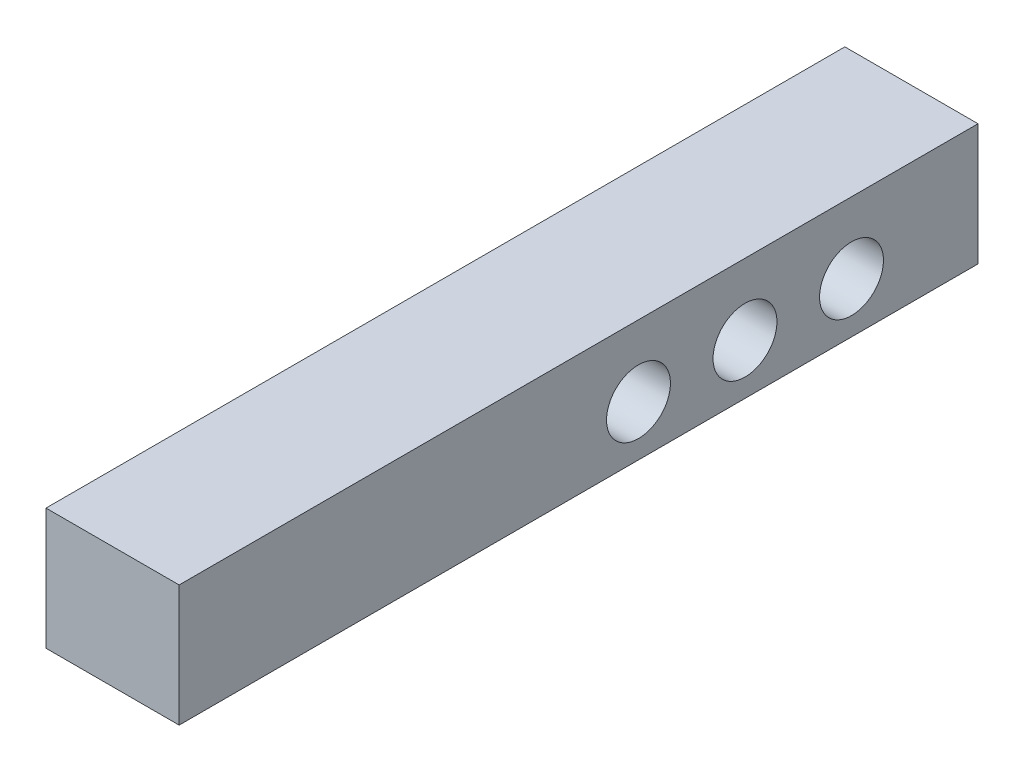
ISO-10303-21;
HEADER;
FILE_DESCRIPTION(('STEP AP214'),'2;1');
FILE_NAME('part.step','',(''),(''),'','','');
FILE_SCHEMA(('AUTOMOTIVE_DESIGN { 1 0 10303 214 1 1 1 1 }'));
ENDSEC;
DATA;
#1=APPLICATION_CONTEXT('core data for automotive mechanical design processes');
#2=APPLICATION_PROTOCOL_DEFINITION('international standard','automotive_design',2000,#1);
#3=PRODUCT_CONTEXT('',#1,'mechanical');
#4=PRODUCT('Part','Part','',(#3));
#5=PRODUCT_RELATED_PRODUCT_CATEGORY('part','',(#4));
#6=PRODUCT_DEFINITION_FORMATION('','',#4);
#7=PRODUCT_DEFINITION_CONTEXT('part definition',#1,'design');
#8=PRODUCT_DEFINITION('design','',#6,#7);
#9=PRODUCT_DEFINITION_SHAPE('','',#8);
#10=(LENGTH_UNIT() NAMED_UNIT(*) SI_UNIT(.MILLI.,.METRE.));
#11=(NAMED_UNIT(*) PLANE_ANGLE_UNIT() SI_UNIT($,.RADIAN.));
#12=(NAMED_UNIT(*) SI_UNIT($,.STERADIAN.) SOLID_ANGLE_UNIT());
#13=UNCERTAINTY_MEASURE_WITH_UNIT(LENGTH_MEASURE(1.E-05),#10,'distance_accuracy_value','');
#14=(GEOMETRIC_REPRESENTATION_CONTEXT(3) GLOBAL_UNCERTAINTY_ASSIGNED_CONTEXT((#13)) GLOBAL_UNIT_ASSIGNED_CONTEXT((#10,
#11,#12)) REPRESENTATION_CONTEXT('',''));
#15=CARTESIAN_POINT('',(0.,0.,0.));
#16=DIRECTION('',(0.,0.,1.));
#17=DIRECTION('',(1.,0.,0.));
#18=AXIS2_PLACEMENT_3D('',#15,#16,#17);
#19=CARTESIAN_POINT('',(-10.,9.12,0.));
#20=DIRECTION('',(1.,0.,0.));
#21=DIRECTION('',(0.,0.,-1.));
#22=AXIS2_PLACEMENT_3D('',#19,#20,#21);
#23=PLANE('',#22);
#24=CARTESIAN_POINT('',(-10.,3.79,25.5));
#25=DIRECTION('',(-1.,0.,0.));
#26=DIRECTION('',(0.,0.,1.));
#27=AXIS2_PLACEMENT_3D('',#24,#25,#26);
#28=CIRCLE('',#27,2.4);
#29=CARTESIAN_POINT('',(-10.,3.79,27.9));
#30=VERTEX_POINT('',#29);
#31=EDGE_CURVE('E122',#30,#30,#28,.T.);
#32=ORIENTED_EDGE('',*,*,#31,.F.);
#33=EDGE_LOOP('',(#32));
#34=FACE_BOUND('',#33,.T.);
#35=CARTESIAN_POINT('',(-10.,3.79,9.5));
#36=DIRECTION('',(-1.,0.,0.));
#37=DIRECTION('',(0.,0.,1.));
#38=AXIS2_PLACEMENT_3D('',#35,#36,#37);
#39=CIRCLE('',#38,2.4);
#40=CARTESIAN_POINT('',(-10.,3.79,11.9));
#41=VERTEX_POINT('',#40);
#42=EDGE_CURVE('E116',#41,#41,#39,.T.);
#43=ORIENTED_EDGE('',*,*,#42,.F.);
#44=EDGE_LOOP('',(#43));
#45=FACE_BOUND('',#44,.T.);
#46=CARTESIAN_POINT('',(-10.,3.79,17.5));
#47=DIRECTION('',(-1.,0.,0.));
#48=DIRECTION('',(0.,0.,1.));
#49=AXIS2_PLACEMENT_3D('',#46,#47,#48);
#50=CIRCLE('',#49,2.4);
#51=CARTESIAN_POINT('',(-10.,3.79,19.9));
#52=VERTEX_POINT('',#51);
#53=EDGE_CURVE('E110',#52,#52,#50,.T.);
#54=ORIENTED_EDGE('',*,*,#53,.F.);
#55=EDGE_LOOP('',(#54));
#56=FACE_BOUND('',#55,.T.);
#57=DIRECTION('',(0.,0.,1.));
#58=VECTOR('',#57,1.);
#59=CARTESIAN_POINT('',(-10.,0.,0.));
#60=LINE('',#59,#58);
#61=CARTESIAN_POINT('',(-10.,0.,0.));
#62=VERTEX_POINT('',#61);
#63=CARTESIAN_POINT('',(-9.99999999999999,0.,60.));
#64=VERTEX_POINT('',#63);
#65=EDGE_CURVE('E96',#62,#64,#60,.T.);
#66=ORIENTED_EDGE('',*,*,#65,.T.);
#67=DIRECTION('',(0.,-1.,0.));
#68=VECTOR('',#67,1.);
#69=CARTESIAN_POINT('',(-9.99999999999999,9.12,60.));
#70=LINE('',#69,#68);
#71=CARTESIAN_POINT('',(-9.99999999999999,9.12,60.));
#72=VERTEX_POINT('',#71);
#73=EDGE_CURVE('E11',#72,#64,#70,.T.);
#74=ORIENTED_EDGE('',*,*,#73,.F.);
#75=DIRECTION('',(0.,0.,1.));
#76=VECTOR('',#75,1.);
#77=CARTESIAN_POINT('',(-10.,9.12,0.));
#78=LINE('',#77,#76);
#79=CARTESIAN_POINT('',(-10.,9.12,0.));
#80=VERTEX_POINT('',#79);
#81=EDGE_CURVE('E84',#80,#72,#78,.T.);
#82=ORIENTED_EDGE('',*,*,#81,.F.);
#83=DIRECTION('',(0.,-1.,0.));
#84=VECTOR('',#83,1.);
#85=CARTESIAN_POINT('',(-10.,9.12,0.));
#86=LINE('',#85,#84);
#87=EDGE_CURVE('E92',#80,#62,#86,.T.);
#88=ORIENTED_EDGE('',*,*,#87,.T.);
#89=EDGE_LOOP('',(#66,#74,#82,#88));
#90=FACE_BOUND('',#89,.T.);
#91=ADVANCED_FACE('F33',(#34,#45,#56,#90),#23,.F.);
#92=CARTESIAN_POINT('',(-9.99999999999999,9.12,60.));
#93=DIRECTION('',(0.,0.,-1.));
#94=DIRECTION('',(-1.,0.,0.));
#95=AXIS2_PLACEMENT_3D('',#92,#93,#94);
#96=PLANE('',#95);
#97=DIRECTION('',(1.,0.,0.));
#98=VECTOR('',#97,1.);
#99=CARTESIAN_POINT('',(-9.99999999999999,0.,60.));
#100=LINE('',#99,#98);
#101=CARTESIAN_POINT('',(0.,0.,60.));
#102=VERTEX_POINT('',#101);
#103=EDGE_CURVE('E88',#64,#102,#100,.T.);
#104=ORIENTED_EDGE('',*,*,#103,.T.);
#105=DIRECTION('',(0.,-1.,0.));
#106=VECTOR('',#105,1.);
#107=CARTESIAN_POINT('',(0.,9.12,60.));
#108=LINE('',#107,#106);
#109=CARTESIAN_POINT('',(0.,9.12,60.));
#110=VERTEX_POINT('',#109);
#111=EDGE_CURVE('E41',#110,#102,#108,.T.);
#112=ORIENTED_EDGE('',*,*,#111,.F.);
#113=DIRECTION('',(1.,0.,0.));
#114=VECTOR('',#113,1.);
#115=CARTESIAN_POINT('',(-9.99999999999999,9.12,60.));
#116=LINE('',#115,#114);
#117=EDGE_CURVE('E79',#72,#110,#116,.T.);
#118=ORIENTED_EDGE('',*,*,#117,.F.);
#119=ORIENTED_EDGE('',*,*,#73,.T.);
#120=EDGE_LOOP('',(#104,#112,#118,#119));
#121=FACE_BOUND('',#120,.T.);
#122=ADVANCED_FACE('F87',(#121),#96,.F.);
#123=CARTESIAN_POINT('',(0.,9.12,0.));
#124=DIRECTION('',(-1.,0.,0.));
#125=DIRECTION('',(0.,0.,1.));
#126=AXIS2_PLACEMENT_3D('',#123,#124,#125);
#127=PLANE('',#126);
#128=CARTESIAN_POINT('',(0.,3.79,25.5));
#129=DIRECTION('',(-1.,0.,0.));
#130=DIRECTION('',(0.,0.,1.));
#131=AXIS2_PLACEMENT_3D('',#128,#129,#130);
#132=CIRCLE('',#131,2.4);
#133=CARTESIAN_POINT('',(0.,3.79,27.9));
#134=VERTEX_POINT('',#133);
#135=EDGE_CURVE('E119',#134,#134,#132,.T.);
#136=ORIENTED_EDGE('',*,*,#135,.T.);
#137=EDGE_LOOP('',(#136));
#138=FACE_BOUND('',#137,.T.);
#139=CARTESIAN_POINT('',(0.,3.79,9.49999999999999));
#140=DIRECTION('',(-1.,0.,0.));
#141=DIRECTION('',(0.,0.,1.));
#142=AXIS2_PLACEMENT_3D('',#139,#140,#141);
#143=CIRCLE('',#142,2.4);
#144=CARTESIAN_POINT('',(0.,3.79,11.9));
#145=VERTEX_POINT('',#144);
#146=EDGE_CURVE('E113',#145,#145,#143,.T.);
#147=ORIENTED_EDGE('',*,*,#146,.T.);
#148=EDGE_LOOP('',(#147));
#149=FACE_BOUND('',#148,.T.);
#150=CARTESIAN_POINT('',(0.,3.79,17.5));
#151=DIRECTION('',(-1.,0.,0.));
#152=DIRECTION('',(0.,0.,1.));
#153=AXIS2_PLACEMENT_3D('',#150,#151,#152);
#154=CIRCLE('',#153,2.4);
#155=CARTESIAN_POINT('',(0.,3.79,19.9));
#156=VERTEX_POINT('',#155);
#157=EDGE_CURVE('E99',#156,#156,#154,.T.);
#158=ORIENTED_EDGE('',*,*,#157,.T.);
#159=EDGE_LOOP('',(#158));
#160=FACE_BOUND('',#159,.T.);
#161=DIRECTION('',(0.,0.,-1.));
#162=VECTOR('',#161,1.);
#163=CARTESIAN_POINT('',(0.,0.,0.));
#164=LINE('',#163,#162);
#165=CARTESIAN_POINT('',(0.,0.,0.));
#166=VERTEX_POINT('',#165);
#167=EDGE_CURVE('E66',#102,#166,#164,.T.);
#168=ORIENTED_EDGE('',*,*,#167,.T.);
#169=DIRECTION('',(0.,-1.,0.));
#170=VECTOR('',#169,1.);
#171=CARTESIAN_POINT('',(0.,9.12,0.));
#172=LINE('',#171,#170);
#173=CARTESIAN_POINT('',(0.,9.12,0.));
#174=VERTEX_POINT('',#173);
#175=EDGE_CURVE('E89',#174,#166,#172,.T.);
#176=ORIENTED_EDGE('',*,*,#175,.F.);
#177=DIRECTION('',(0.,0.,-1.));
#178=VECTOR('',#177,1.);
#179=CARTESIAN_POINT('',(0.,9.12,0.));
#180=LINE('',#179,#178);
#181=EDGE_CURVE('E82',#110,#174,#180,.T.);
#182=ORIENTED_EDGE('',*,*,#181,.F.);
#183=ORIENTED_EDGE('',*,*,#111,.T.);
#184=EDGE_LOOP('',(#168,#176,#182,#183));
#185=FACE_BOUND('',#184,.T.);
#186=ADVANCED_FACE('F90',(#138,#149,#160,#185),#127,.F.);
#187=CARTESIAN_POINT('',(-10.,9.12,0.));
#188=DIRECTION('',(0.,0.,1.));
#189=DIRECTION('',(1.,0.,0.));
#190=AXIS2_PLACEMENT_3D('',#187,#188,#189);
#191=PLANE('',#190);
#192=DIRECTION('',(-1.,0.,0.));
#193=VECTOR('',#192,1.);
#194=CARTESIAN_POINT('',(-10.,0.,0.));
#195=LINE('',#194,#193);
#196=EDGE_CURVE('E72',#166,#62,#195,.T.);
#197=ORIENTED_EDGE('',*,*,#196,.T.);
#198=ORIENTED_EDGE('',*,*,#87,.F.);
#199=DIRECTION('',(-1.,0.,0.));
#200=VECTOR('',#199,1.);
#201=CARTESIAN_POINT('',(-10.,9.12,0.));
#202=LINE('',#201,#200);
#203=EDGE_CURVE('E49',#174,#80,#202,.T.);
#204=ORIENTED_EDGE('',*,*,#203,.F.);
#205=ORIENTED_EDGE('',*,*,#175,.T.);
#206=EDGE_LOOP('',(#197,#198,#204,#205));
#207=FACE_BOUND('',#206,.T.);
#208=ADVANCED_FACE('F104',(#207),#191,.F.);
#209=CARTESIAN_POINT('',(0.,9.12,0.));
#210=DIRECTION('',(0.,1.,0.));
#211=DIRECTION('',(0.,0.,1.));
#212=AXIS2_PLACEMENT_3D('',#209,#210,#211);
#213=PLANE('',#212);
#214=ORIENTED_EDGE('',*,*,#81,.T.);
#215=ORIENTED_EDGE('',*,*,#117,.T.);
#216=ORIENTED_EDGE('',*,*,#181,.T.);
#217=ORIENTED_EDGE('',*,*,#203,.T.);
#218=EDGE_LOOP('',(#214,#215,#216,#217));
#219=FACE_BOUND('',#218,.T.);
#220=ADVANCED_FACE('F80',(#219),#213,.T.);
#221=CARTESIAN_POINT('',(0.,0.,0.));
#222=DIRECTION('',(0.,1.,0.));
#223=DIRECTION('',(0.,0.,1.));
#224=AXIS2_PLACEMENT_3D('',#221,#222,#223);
#225=PLANE('',#224);
#226=ORIENTED_EDGE('',*,*,#65,.F.);
#227=ORIENTED_EDGE('',*,*,#196,.F.);
#228=ORIENTED_EDGE('',*,*,#167,.F.);
#229=ORIENTED_EDGE('',*,*,#103,.F.);
#230=EDGE_LOOP('',(#226,#227,#228,#229));
#231=FACE_BOUND('',#230,.T.);
#232=ADVANCED_FACE('F107',(#231),#225,.F.);
#233=CARTESIAN_POINT('',(0.,3.79,17.5));
#234=DIRECTION('',(-1.,0.,0.));
#235=DIRECTION('',(0.,0.,1.));
#236=AXIS2_PLACEMENT_3D('',#233,#234,#235);
#237=CYLINDRICAL_SURFACE('',#236,2.4);
#238=ORIENTED_EDGE('',*,*,#157,.F.);
#239=EDGE_LOOP('',(#238));
#240=FACE_BOUND('',#239,.T.);
#241=ORIENTED_EDGE('',*,*,#53,.T.);
#242=EDGE_LOOP('',(#241));
#243=FACE_BOUND('',#242,.T.);
#244=ADVANCED_FACE('F143',(#240,#243),#237,.F.);
#245=CARTESIAN_POINT('',(0.,3.79,9.49999999999999));
#246=DIRECTION('',(-1.,0.,0.));
#247=DIRECTION('',(0.,0.,1.));
#248=AXIS2_PLACEMENT_3D('',#245,#246,#247);
#249=CYLINDRICAL_SURFACE('',#248,2.4);
#250=ORIENTED_EDGE('',*,*,#146,.F.);
#251=EDGE_LOOP('',(#250));
#252=FACE_BOUND('',#251,.T.);
#253=ORIENTED_EDGE('',*,*,#42,.T.);
#254=EDGE_LOOP('',(#253));
#255=FACE_BOUND('',#254,.T.);
#256=ADVANCED_FACE('F133',(#252,#255),#249,.F.);
#257=CARTESIAN_POINT('',(0.,3.79,25.5));
#258=DIRECTION('',(-1.,0.,0.));
#259=DIRECTION('',(0.,0.,1.));
#260=AXIS2_PLACEMENT_3D('',#257,#258,#259);
#261=CYLINDRICAL_SURFACE('',#260,2.4);
#262=ORIENTED_EDGE('',*,*,#135,.F.);
#263=EDGE_LOOP('',(#262));
#264=FACE_BOUND('',#263,.T.);
#265=ORIENTED_EDGE('',*,*,#31,.T.);
#266=EDGE_LOOP('',(#265));
#267=FACE_BOUND('',#266,.T.);
#268=ADVANCED_FACE('F130',(#264,#267),#261,.F.);
#269=CLOSED_SHELL('',(#91,#122,#186,#208,#220,#232,#244,#256,#268));
#270=MANIFOLD_SOLID_BREP('B2',#269);
#271=ADVANCED_BREP_SHAPE_REPRESENTATION('',(#18,#270),#14);
#272=SHAPE_DEFINITION_REPRESENTATION(#9,#271);
ENDSEC;
END-ISO-10303-21;
